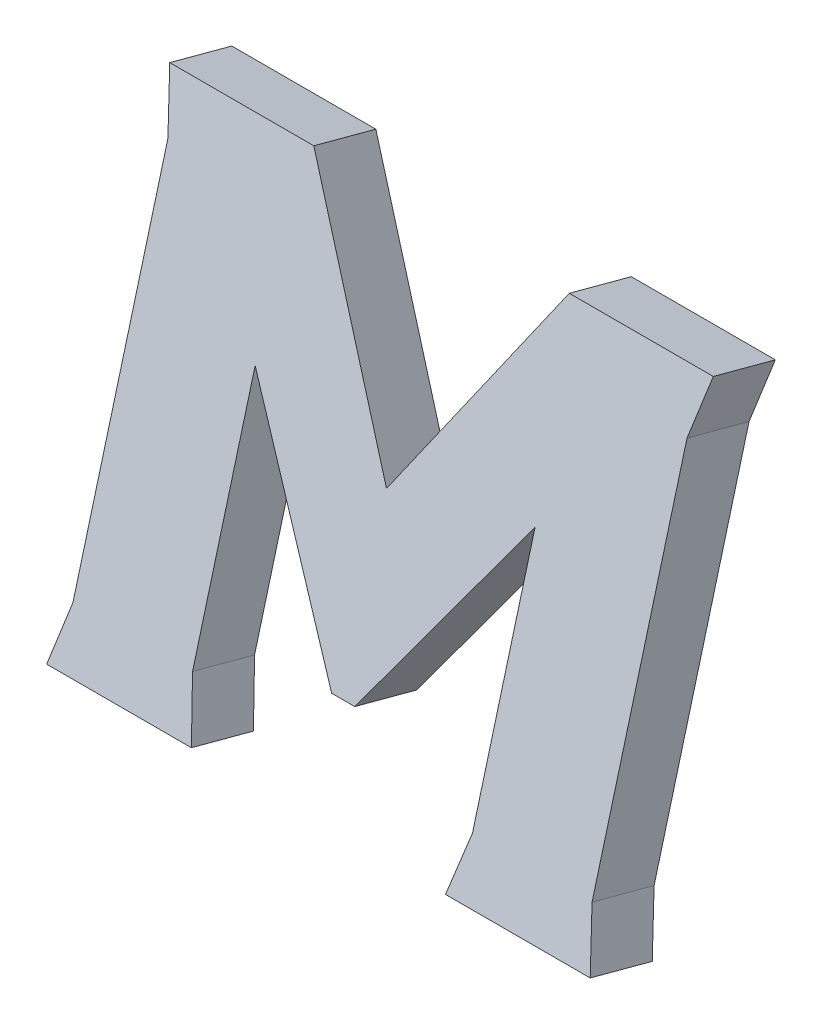
ISO-10303-21;
HEADER;
FILE_DESCRIPTION(('STEP AP214'),'2;1');
FILE_NAME('part.step','',(''),(''),'','','');
FILE_SCHEMA(('AUTOMOTIVE_DESIGN { 1 0 10303 214 1 1 1 1 }'));
ENDSEC;
DATA;
#1=APPLICATION_CONTEXT('core data for automotive mechanical design processes');
#2=APPLICATION_PROTOCOL_DEFINITION('international standard','automotive_design',2000,#1);
#3=PRODUCT_CONTEXT('',#1,'mechanical');
#4=PRODUCT('Part','Part','',(#3));
#5=PRODUCT_RELATED_PRODUCT_CATEGORY('part','',(#4));
#6=PRODUCT_DEFINITION_FORMATION('','',#4);
#7=PRODUCT_DEFINITION_CONTEXT('part definition',#1,'design');
#8=PRODUCT_DEFINITION('design','',#6,#7);
#9=PRODUCT_DEFINITION_SHAPE('','',#8);
#10=(LENGTH_UNIT() NAMED_UNIT(*) SI_UNIT(.MILLI.,.METRE.));
#11=(NAMED_UNIT(*) PLANE_ANGLE_UNIT() SI_UNIT($,.RADIAN.));
#12=(NAMED_UNIT(*) SI_UNIT($,.STERADIAN.) SOLID_ANGLE_UNIT());
#13=UNCERTAINTY_MEASURE_WITH_UNIT(LENGTH_MEASURE(1.E-05),#10,'distance_accuracy_value','');
#14=(GEOMETRIC_REPRESENTATION_CONTEXT(3) GLOBAL_UNCERTAINTY_ASSIGNED_CONTEXT((#13)) GLOBAL_UNIT_ASSIGNED_CONTEXT((#10,
#11,#12)) REPRESENTATION_CONTEXT('',''));
#15=CARTESIAN_POINT('',(0.,0.,0.));
#16=DIRECTION('',(0.,0.,1.));
#17=DIRECTION('',(1.,0.,0.));
#18=AXIS2_PLACEMENT_3D('',#15,#16,#17);
#19=CARTESIAN_POINT('',(5.71283602222444,197.836937315129,-21.9519621743323));
#20=DIRECTION('',(0.999999999999891,4.50875248794487E-07,-1.20811658801663E-07));
#21=DIRECTION('',(-4.50875248794491E-07,0.999999999999899,0.));
#22=AXIS2_PLACEMENT_3D('',#19,#20,#21);
#23=PLANE('',#22);
#24=DIRECTION('',(4.66780405413403E-07,-0.965925826288964,0.25881904510249));
#25=VECTOR('',#24,1.);
#26=CARTESIAN_POINT('',(5.71283602222444,190.072365962053,-50.9297369630043));
#27=LINE('',#26,#25);
#28=CARTESIAN_POINT('',(5.71283602222444,190.072365962053,-50.9297369630043));
#29=VERTEX_POINT('',#28);
#30=CARTESIAN_POINT('',(5.71291602222442,24.5254295570136,-6.57156904382809));
#31=VERTEX_POINT('',#30);
#32=EDGE_CURVE('E205',#29,#31,#27,.T.);
#33=ORIENTED_EDGE('',*,*,#32,.T.);
#34=DIRECTION('',(0.,-0.258819045102518,-0.965925826289069));
#35=VECTOR('',#34,1.);
#36=CARTESIAN_POINT('',(5.71291602222442,32.2900009100891,22.406205744844));
#37=LINE('',#36,#35);
#38=CARTESIAN_POINT('',(5.71291602222442,32.2900009100891,22.406205744844));
#39=VERTEX_POINT('',#38);
#40=EDGE_CURVE('E11',#39,#31,#37,.T.);
#41=ORIENTED_EDGE('',*,*,#40,.F.);
#42=DIRECTION('',(4.66780405413403E-07,-0.965925826288964,0.25881904510249));
#43=VECTOR('',#42,1.);
#44=CARTESIAN_POINT('',(5.71283602222444,197.836937315129,-21.9519621743323));
#45=LINE('',#44,#43);
#46=CARTESIAN_POINT('',(5.71283602222444,197.836937315129,-21.9519621743323));
#47=VERTEX_POINT('',#46);
#48=EDGE_CURVE('E241',#47,#39,#45,.T.);
#49=ORIENTED_EDGE('',*,*,#48,.F.);
#50=DIRECTION('',(0.,-0.258819045102518,-0.965925826289069));
#51=VECTOR('',#50,1.);
#52=CARTESIAN_POINT('',(5.71283602222444,197.836937315129,-21.9519621743323));
#53=LINE('',#52,#51);
#54=EDGE_CURVE('E201',#47,#29,#53,.T.);
#55=ORIENTED_EDGE('',*,*,#54,.T.);
#56=EDGE_LOOP('',(#33,#41,#49,#55));
#57=FACE_BOUND('',#56,.T.);
#58=ADVANCED_FACE('F43',(#57),#23,.F.);
#59=CARTESIAN_POINT('',(5.71291602222442,32.2900009100891,22.406205744844));
#60=DIRECTION('',(0.975609468087844,-0.212033734876684,0.0568142680283616));
#61=DIRECTION('',(0.212376773277867,0.977187856132116,0.));
#62=AXIS2_PLACEMENT_3D('',#59,#60,#61);
#63=PLANE('',#62);
#64=DIRECTION('',(-0.219513475161218,-0.94236638159819,0.252506310923471));
#65=VECTOR('',#64,1.);
#66=CARTESIAN_POINT('',(5.71291602222442,24.5254295570136,-6.57156904382809));
#67=LINE('',#66,#65);
#68=CARTESIAN_POINT('',(-3.97777558579935E-06,-6.72796169791307E-06,1.80275190366331E-06));
#69=VERTEX_POINT('',#68);
#70=EDGE_CURVE('E208',#31,#69,#67,.T.);
#71=ORIENTED_EDGE('',*,*,#70,.T.);
#72=DIRECTION('',(0.,-0.258819045102518,-0.965925826289069));
#73=VECTOR('',#72,1.);
#74=CARTESIAN_POINT('',(-3.97777558579935E-06,7.76456462511384,28.977776591424));
#75=LINE('',#74,#73);
#76=CARTESIAN_POINT('',(-3.97777558579935E-06,7.76456462511384,28.977776591424));
#77=VERTEX_POINT('',#76);
#78=EDGE_CURVE('E51',#77,#69,#75,.T.);
#79=ORIENTED_EDGE('',*,*,#78,.F.);
#80=DIRECTION('',(-0.219513475161218,-0.94236638159819,0.252506310923471));
#81=VECTOR('',#80,1.);
#82=CARTESIAN_POINT('',(5.71291602222442,32.2900009100891,22.406205744844));
#83=LINE('',#82,#81);
#84=EDGE_CURVE('E135',#39,#77,#83,.T.);
#85=ORIENTED_EDGE('',*,*,#84,.F.);
#86=ORIENTED_EDGE('',*,*,#40,.T.);
#87=EDGE_LOOP('',(#71,#79,#85,#86));
#88=FACE_BOUND('',#87,.T.);
#89=ADVANCED_FACE('F354',(#88),#63,.F.);
#90=CARTESIAN_POINT('',(-3.97777558579935E-06,7.76456462511384,28.977776591424));
#91=DIRECTION('',(5.91664161961705E-06,0.965925826272162,-0.258819045097988));
#92=DIRECTION('',(0.,0.258819045102518,0.965925826289069));
#93=AXIS2_PLACEMENT_3D('',#90,#91,#92);
#94=PLANE('',#93);
#95=DIRECTION('',(0.999999999982497,-5.7150369452849E-06,1.5313395342031E-06));
#96=VECTOR('',#95,1.);
#97=CARTESIAN_POINT('',(-3.97777558579935E-06,-6.72796169791307E-06,1.80275190366331E-06));
#98=LINE('',#97,#96);
#99=CARTESIAN_POINT('',(67.6059160222244,-0.000393098292224651,0.000105330369947647));
#100=VERTEX_POINT('',#99);
#101=EDGE_CURVE('E210',#69,#100,#98,.T.);
#102=ORIENTED_EDGE('',*,*,#101,.T.);
#103=DIRECTION('',(0.,-0.258819045102518,-0.965925826289069));
#104=VECTOR('',#103,1.);
#105=CARTESIAN_POINT('',(67.6059160222244,7.76417825478331,28.977880119042));
#106=LINE('',#105,#104);
#107=CARTESIAN_POINT('',(67.6059160222244,7.76417825478331,28.977880119042));
#108=VERTEX_POINT('',#107);
#109=EDGE_CURVE('E281',#108,#100,#106,.T.);
#110=ORIENTED_EDGE('',*,*,#109,.F.);
#111=DIRECTION('',(0.999999999982497,-5.7150369452849E-06,1.5313395342031E-06));
#112=VECTOR('',#111,1.);
#113=CARTESIAN_POINT('',(-3.97777558579935E-06,7.76456462511384,28.977776591424));
#114=LINE('',#113,#112);
#115=EDGE_CURVE('E289',#77,#108,#114,.T.);
#116=ORIENTED_EDGE('',*,*,#115,.F.);
#117=ORIENTED_EDGE('',*,*,#78,.T.);
#118=EDGE_LOOP('',(#102,#110,#116,#117));
#119=FACE_BOUND('',#118,.T.);
#120=ADVANCED_FACE('F287',(#119),#94,.F.);
#121=CARTESIAN_POINT('',(67.6059160222244,7.76417825478331,28.977880119042));
#122=DIRECTION('',(-0.972908180052972,-0.223314182251239,0.0598368547926354));
#123=DIRECTION('',(0.22371504155692,-0.974654595321433,0.));
#124=AXIS2_PLACEMENT_3D('',#121,#122,#123);
#125=PLANE('',#124);
#126=DIRECTION('',(-0.231191853632464,0.939757137721061,-0.251807166133739));
#127=VECTOR('',#126,1.);
#128=CARTESIAN_POINT('',(67.6059160222244,-0.000393098292224651,0.000105330369947647));
#129=LINE('',#128,#127);
#130=CARTESIAN_POINT('',(61.5723560222244,24.525043186683,-6.57146551621006));
#131=VERTEX_POINT('',#130);
#132=EDGE_CURVE('E212',#100,#131,#129,.T.);
#133=ORIENTED_EDGE('',*,*,#132,.T.);
#134=DIRECTION('',(0.,-0.258819045102518,-0.965925826289069));
#135=VECTOR('',#134,1.);
#136=CARTESIAN_POINT('',(61.5723560222244,32.2896145397586,22.406309272462));
#137=LINE('',#136,#135);
#138=CARTESIAN_POINT('',(61.5723560222244,32.2896145397586,22.406309272462));
#139=VERTEX_POINT('',#138);
#140=EDGE_CURVE('E278',#139,#131,#137,.T.);
#141=ORIENTED_EDGE('',*,*,#140,.F.);
#142=DIRECTION('',(-0.231191853632464,0.939757137721061,-0.251807166133739));
#143=VECTOR('',#142,1.);
#144=CARTESIAN_POINT('',(67.6059160222244,7.76417825478331,28.977880119042));
#145=LINE('',#144,#143);
#146=EDGE_CURVE('E307',#108,#139,#145,.T.);
#147=ORIENTED_EDGE('',*,*,#146,.F.);
#148=ORIENTED_EDGE('',*,*,#109,.T.);
#149=EDGE_LOOP('',(#133,#141,#147,#148));
#150=FACE_BOUND('',#149,.T.);
#151=ADVANCED_FACE('F298',(#150),#125,.F.);
#152=CARTESIAN_POINT('',(61.5723560222244,32.2896145397586,22.406309272462));
#153=DIRECTION('',(-0.999999999992418,-3.76147995789642E-06,1.00788551706419E-06));
#154=DIRECTION('',(3.76147995789833E-06,-0.999999999992926,0.));
#155=AXIS2_PLACEMENT_3D('',#152,#153,#154);
#156=PLANE('',#155);
#157=DIRECTION('',(-3.89417060350008E-06,0.965925826281745,-0.258819045100556));
#158=VECTOR('',#157,1.);
#159=CARTESIAN_POINT('',(61.5723560222244,24.525043186683,-6.57146551621006));
#160=LINE('',#159,#158);
#161=CARTESIAN_POINT('',(61.5719160222244,133.664422743589,-35.8152741309165));
#162=VERTEX_POINT('',#161);
#163=EDGE_CURVE('E214',#131,#162,#160,.T.);
#164=ORIENTED_EDGE('',*,*,#163,.T.);
#165=DIRECTION('',(0.,-0.258819045102518,-0.965925826289069));
#166=VECTOR('',#165,1.);
#167=CARTESIAN_POINT('',(61.5719160222244,141.428994096665,-6.83749934224441));
#168=LINE('',#167,#166);
#169=CARTESIAN_POINT('',(61.5719160222244,141.428994096665,-6.83749934224441));
#170=VERTEX_POINT('',#169);
#171=EDGE_CURVE('E275',#170,#162,#168,.T.);
#172=ORIENTED_EDGE('',*,*,#171,.F.);
#173=DIRECTION('',(-3.89417060350008E-06,0.965925826281745,-0.258819045100556));
#174=VECTOR('',#173,1.);
#175=CARTESIAN_POINT('',(61.5723560222244,32.2896145397586,22.406309272462));
#176=LINE('',#175,#174);
#177=EDGE_CURVE('E304',#139,#170,#176,.T.);
#178=ORIENTED_EDGE('',*,*,#177,.F.);
#179=ORIENTED_EDGE('',*,*,#140,.T.);
#180=EDGE_LOOP('',(#164,#172,#178,#179));
#181=FACE_BOUND('',#180,.T.);
#182=ADVANCED_FACE('F302',(#181),#156,.F.);
#183=CARTESIAN_POINT('',(61.5719160222244,141.428994096665,-6.83749934224441));
#184=DIRECTION('',(0.842009653147177,0.521080720867627,-0.139623158347906));
#185=DIRECTION('',(-0.526235347120746,0.850338967377544,0.));
#186=AXIS2_PLACEMENT_3D('',#183,#184,#185);
#187=PLANE('',#186);
#188=DIRECTION('',(0.539462458385169,-0.813318869959559,0.217928134394655));
#189=VECTOR('',#188,1.);
#190=CARTESIAN_POINT('',(61.5719160222244,133.664422743589,-35.8152741309165));
#191=LINE('',#190,#189);
#192=CARTESIAN_POINT('',(121.557916022224,43.2267194797962,-11.5825645760579));
#193=VERTEX_POINT('',#192);
#194=EDGE_CURVE('E216',#162,#193,#191,.T.);
#195=ORIENTED_EDGE('',*,*,#194,.T.);
#196=DIRECTION('',(0.,-0.258819045102518,-0.965925826289069));
#197=VECTOR('',#196,1.);
#198=CARTESIAN_POINT('',(121.557916022224,50.9912908328717,17.3952102126141));
#199=LINE('',#198,#197);
#200=CARTESIAN_POINT('',(121.557916022224,50.9912908328717,17.3952102126141));
#201=VERTEX_POINT('',#200);
#202=EDGE_CURVE('E272',#201,#193,#199,.T.);
#203=ORIENTED_EDGE('',*,*,#202,.F.);
#204=DIRECTION('',(0.539462458385169,-0.813318869959559,0.217928134394655));
#205=VECTOR('',#204,1.);
#206=CARTESIAN_POINT('',(61.5719160222244,141.428994096665,-6.83749934224441));
#207=LINE('',#206,#205);
#208=EDGE_CURVE('E306',#170,#201,#207,.T.);
#209=ORIENTED_EDGE('',*,*,#208,.F.);
#210=ORIENTED_EDGE('',*,*,#171,.T.);
#211=EDGE_LOOP('',(#195,#203,#209,#210));
#212=FACE_BOUND('',#211,.T.);
#213=ADVANCED_FACE('F367',(#212),#187,.F.);
#214=CARTESIAN_POINT('',(121.557916022224,50.9912908328717,17.3952102126141));
#215=DIRECTION('',(0.,0.965925826289069,-0.258819045102518));
#216=DIRECTION('',(0.,0.258819045102518,0.965925826289069));
#217=AXIS2_PLACEMENT_3D('',#214,#215,#216);
#218=PLANE('',#217);
#219=DIRECTION('',(1.,0.,0.));
#220=VECTOR('',#219,1.);
#221=CARTESIAN_POINT('',(121.557916022224,43.2267194797962,-11.5825645760579));
#222=LINE('',#221,#220);
#223=CARTESIAN_POINT('',(132.350916022224,43.2267194797962,-11.5825645760579));
#224=VERTEX_POINT('',#223);
#225=EDGE_CURVE('E218',#193,#224,#222,.T.);
#226=ORIENTED_EDGE('',*,*,#225,.T.);
#227=DIRECTION('',(0.,-0.258819045102518,-0.965925826289069));
#228=VECTOR('',#227,1.);
#229=CARTESIAN_POINT('',(132.350916022224,50.9912908328717,17.3952102126141));
#230=LINE('',#229,#228);
#231=CARTESIAN_POINT('',(132.350916022224,50.9912908328717,17.3952102126141));
#232=VERTEX_POINT('',#231);
#233=EDGE_CURVE('E269',#232,#224,#230,.T.);
#234=ORIENTED_EDGE('',*,*,#233,.F.);
#235=DIRECTION('',(1.,0.,0.));
#236=VECTOR('',#235,1.);
#237=CARTESIAN_POINT('',(121.557916022224,50.9912908328717,17.3952102126141));
#238=LINE('',#237,#236);
#239=EDGE_CURVE('E309',#201,#232,#238,.T.);
#240=ORIENTED_EDGE('',*,*,#239,.F.);
#241=ORIENTED_EDGE('',*,*,#202,.T.);
#242=EDGE_LOOP('',(#226,#234,#240,#241));
#243=FACE_BOUND('',#242,.T.);
#244=ADVANCED_FACE('F370',(#243),#218,.F.);
#245=CARTESIAN_POINT('',(132.350916022224,50.9912908328717,17.3952102126141));
#246=DIRECTION('',(-0.842028035456382,0.521053005797697,-0.1396157321173));
#247=DIRECTION('',(-0.526206801445373,-0.850356632309427,0.));
#248=AXIS2_PLACEMENT_3D('',#245,#246,#247);
#249=PLANE('',#248);
#250=DIRECTION('',(0.539433765633433,0.813336625906768,-0.21793289208637));
#251=VECTOR('',#250,1.);
#252=CARTESIAN_POINT('',(132.350916022224,43.2267194797962,-11.5825645760579));
#253=LINE('',#252,#251);
#254=CARTESIAN_POINT('',(192.332416022224,133.664422743589,-35.8152741309164));
#255=VERTEX_POINT('',#254);
#256=EDGE_CURVE('E220',#224,#255,#253,.T.);
#257=ORIENTED_EDGE('',*,*,#256,.T.);
#258=DIRECTION('',(0.,-0.258819045102518,-0.965925826289069));
#259=VECTOR('',#258,1.);
#260=CARTESIAN_POINT('',(192.332416022224,141.428994096664,-6.83749934224431));
#261=LINE('',#260,#259);
#262=CARTESIAN_POINT('',(192.332416022224,141.428994096664,-6.83749934224431));
#263=VERTEX_POINT('',#262);
#264=EDGE_CURVE('E266',#263,#255,#261,.T.);
#265=ORIENTED_EDGE('',*,*,#264,.F.);
#266=DIRECTION('',(0.539433765633433,0.813336625906768,-0.21793289208637));
#267=VECTOR('',#266,1.);
#268=CARTESIAN_POINT('',(132.350916022224,50.9912908328717,17.3952102126141));
#269=LINE('',#268,#267);
#270=EDGE_CURVE('E315',#232,#263,#269,.T.);
#271=ORIENTED_EDGE('',*,*,#270,.F.);
#272=ORIENTED_EDGE('',*,*,#233,.T.);
#273=EDGE_LOOP('',(#257,#265,#271,#272));
#274=FACE_BOUND('',#273,.T.);
#275=ADVANCED_FACE('F374',(#274),#249,.F.);
#276=CARTESIAN_POINT('',(192.332416022224,141.428994096664,-6.83749934224431));
#277=DIRECTION('',(1.,0.,0.));
#278=DIRECTION('',(0.,0.,-1.));
#279=AXIS2_PLACEMENT_3D('',#276,#277,#278);
#280=PLANE('',#279);
#281=DIRECTION('',(0.,-0.965925826289069,0.258819045102518));
#282=VECTOR('',#281,1.);
#283=CARTESIAN_POINT('',(192.332416022224,133.664422743589,-35.8152741309164));
#284=LINE('',#283,#282);
#285=CARTESIAN_POINT('',(192.332416022224,24.5254295570126,-6.57156904382785));
#286=VERTEX_POINT('',#285);
#287=EDGE_CURVE('E222',#255,#286,#284,.T.);
#288=ORIENTED_EDGE('',*,*,#287,.T.);
#289=DIRECTION('',(0.,-0.258819045102518,-0.965925826289069));
#290=VECTOR('',#289,1.);
#291=CARTESIAN_POINT('',(192.332416022224,32.2900009100882,22.4062057448442));
#292=LINE('',#291,#290);
#293=CARTESIAN_POINT('',(192.332416022224,32.2900009100882,22.4062057448442));
#294=VERTEX_POINT('',#293);
#295=EDGE_CURVE('E263',#294,#286,#292,.T.);
#296=ORIENTED_EDGE('',*,*,#295,.F.);
#297=DIRECTION('',(0.,-0.965925826289069,0.258819045102518));
#298=VECTOR('',#297,1.);
#299=CARTESIAN_POINT('',(192.332416022224,141.428994096664,-6.83749934224431));
#300=LINE('',#299,#298);
#301=EDGE_CURVE('E317',#263,#294,#300,.T.);
#302=ORIENTED_EDGE('',*,*,#301,.F.);
#303=ORIENTED_EDGE('',*,*,#264,.T.);
#304=EDGE_LOOP('',(#288,#296,#302,#303));
#305=FACE_BOUND('',#304,.T.);
#306=ADVANCED_FACE('F378',(#305),#280,.F.);
#307=CARTESIAN_POINT('',(192.332416022224,32.2900009100882,22.4062057448442));
#308=DIRECTION('',(0.972944109727372,-0.223168083503276,0.0597977077511034));
#309=DIRECTION('',(0.223568155151618,0.974688298894627,0.));
#310=AXIS2_PLACEMENT_3D('',#307,#308,#309);
#311=PLANE('',#310);
#312=DIRECTION('',(-0.231040601078709,-0.939791843121495,0.251816465417758));
#313=VECTOR('',#312,1.);
#314=CARTESIAN_POINT('',(192.332416022224,24.5254295570126,-6.57156904382785));
#315=LINE('',#314,#313);
#316=CARTESIAN_POINT('',(186.303026022224,-6.7279617247229E-06,1.80275191084698E-06));
#317=VERTEX_POINT('',#316);
#318=EDGE_CURVE('E224',#286,#317,#315,.T.);
#319=ORIENTED_EDGE('',*,*,#318,.T.);
#320=DIRECTION('',(0.,-0.258819045102518,-0.965925826289069));
#321=VECTOR('',#320,1.);
#322=CARTESIAN_POINT('',(186.303026022224,7.76456462511381,28.977776591424));
#323=LINE('',#322,#321);
#324=CARTESIAN_POINT('',(186.303026022224,7.76456462511381,28.977776591424));
#325=VERTEX_POINT('',#324);
#326=EDGE_CURVE('E260',#325,#317,#323,.T.);
#327=ORIENTED_EDGE('',*,*,#326,.F.);
#328=DIRECTION('',(-0.231040601078709,-0.939791843121495,0.251816465417758));
#329=VECTOR('',#328,1.);
#330=CARTESIAN_POINT('',(192.332416022224,32.2900009100882,22.4062057448442));
#331=LINE('',#330,#329);
#332=EDGE_CURVE('E319',#294,#325,#331,.T.);
#333=ORIENTED_EDGE('',*,*,#332,.F.);
#334=ORIENTED_EDGE('',*,*,#295,.T.);
#335=EDGE_LOOP('',(#319,#327,#333,#334));
#336=FACE_BOUND('',#335,.T.);
#337=ADVANCED_FACE('F382',(#336),#311,.F.);
#338=CARTESIAN_POINT('',(186.303026022224,7.76456462511381,28.977776591424));
#339=DIRECTION('',(5.91691555932085E-06,0.965925826272161,-0.258819045097987));
#340=DIRECTION('',(0.,0.258819045102518,0.965925826289069));
#341=AXIS2_PLACEMENT_3D('',#338,#339,#340);
#342=PLANE('',#341);
#343=DIRECTION('',(0.999999999982495,-5.71530155071964E-06,1.53141043501565E-06));
#344=VECTOR('',#343,1.);
#345=CARTESIAN_POINT('',(186.303026022224,-6.7279617247229E-06,1.80275191084698E-06));
#346=LINE('',#345,#344);
#347=CARTESIAN_POINT('',(253.905816022224,-0.000393098292251461,0.000105330369954831));
#348=VERTEX_POINT('',#347);
#349=EDGE_CURVE('E226',#317,#348,#346,.T.);
#350=ORIENTED_EDGE('',*,*,#349,.T.);
#351=DIRECTION('',(0.,-0.258819045102518,-0.965925826289069));
#352=VECTOR('',#351,1.);
#353=CARTESIAN_POINT('',(253.905816022224,7.76417825478329,28.977880119042));
#354=LINE('',#353,#352);
#355=CARTESIAN_POINT('',(253.905816022224,7.76417825478329,28.977880119042));
#356=VERTEX_POINT('',#355);
#357=EDGE_CURVE('E257',#356,#348,#354,.T.);
#358=ORIENTED_EDGE('',*,*,#357,.F.);
#359=DIRECTION('',(0.999999999982495,-5.71530155071964E-06,1.53141043501565E-06));
#360=VECTOR('',#359,1.);
#361=CARTESIAN_POINT('',(186.303026022224,7.76456462511381,28.977776591424));
#362=LINE('',#361,#360);
#363=EDGE_CURVE('E321',#325,#356,#362,.T.);
#364=ORIENTED_EDGE('',*,*,#363,.F.);
#365=ORIENTED_EDGE('',*,*,#326,.T.);
#366=EDGE_LOOP('',(#350,#358,#364,#365));
#367=FACE_BOUND('',#366,.T.);
#368=ADVANCED_FACE('F386',(#367),#342,.F.);
#369=CARTESIAN_POINT('',(253.905816022224,7.76417825478329,28.977880119042));
#370=DIRECTION('',(-0.975612841821234,-0.212019250995848,0.0568103870841883));
#371=DIRECTION('',(0.212362218989904,-0.977191019169581,0.));
#372=AXIS2_PLACEMENT_3D('',#369,#370,#371);
#373=PLANE('',#372);
#374=DIRECTION('',(-0.219498480344388,0.942369640374402,-0.252507184109926));
#375=VECTOR('',#374,1.);
#376=CARTESIAN_POINT('',(253.905816022224,-0.000393098292251461,0.000105330369954831));
#377=LINE('',#376,#375);
#378=CARTESIAN_POINT('',(248.193306022224,24.5250431866831,-6.57146551621008));
#379=VERTEX_POINT('',#378);
#380=EDGE_CURVE('E228',#348,#379,#377,.T.);
#381=ORIENTED_EDGE('',*,*,#380,.T.);
#382=DIRECTION('',(0.,-0.258819045102518,-0.965925826289069));
#383=VECTOR('',#382,1.);
#384=CARTESIAN_POINT('',(248.193306022224,32.2896145397587,22.406309272462));
#385=LINE('',#384,#383);
#386=CARTESIAN_POINT('',(248.193306022224,32.2896145397587,22.406309272462));
#387=VERTEX_POINT('',#386);
#388=EDGE_CURVE('E254',#387,#379,#385,.T.);
#389=ORIENTED_EDGE('',*,*,#388,.F.);
#390=DIRECTION('',(-0.219498480344388,0.942369640374402,-0.252507184109926));
#391=VECTOR('',#390,1.);
#392=CARTESIAN_POINT('',(253.905816022224,7.76417825478329,28.977880119042));
#393=LINE('',#392,#391);
#394=EDGE_CURVE('E323',#356,#387,#393,.T.);
#395=ORIENTED_EDGE('',*,*,#394,.F.);
#396=ORIENTED_EDGE('',*,*,#357,.T.);
#397=EDGE_LOOP('',(#381,#389,#395,#396));
#398=FACE_BOUND('',#397,.T.);
#399=ADVANCED_FACE('F390',(#398),#373,.F.);
#400=CARTESIAN_POINT('',(248.193306022224,32.2896145397587,22.406309272462));
#401=DIRECTION('',(-0.999999999999985,-1.69077626321532E-07,4.53042134310252E-08));
#402=DIRECTION('',(1.69077626321533E-07,-0.999999999999986,0.));
#403=AXIS2_PLACEMENT_3D('',#400,#401,#402);
#404=PLANE('',#403);
#405=DIRECTION('',(-1.75042039170959E-07,0.965925826289054,-0.258819045102514));
#406=VECTOR('',#405,1.);
#407=CARTESIAN_POINT('',(248.193306022224,24.5250431866831,-6.57146551621008));
#408=LINE('',#407,#406);
#409=CARTESIAN_POINT('',(248.193276022224,190.072559147218,-50.9297887268133));
#410=VERTEX_POINT('',#409);
#411=EDGE_CURVE('E230',#379,#410,#408,.T.);
#412=ORIENTED_EDGE('',*,*,#411,.T.);
#413=DIRECTION('',(0.,-0.258819045102518,-0.965925826289069));
#414=VECTOR('',#413,1.);
#415=CARTESIAN_POINT('',(248.193276022224,197.837130500294,-21.9520139381413));
#416=LINE('',#415,#414);
#417=CARTESIAN_POINT('',(248.193276022224,197.837130500294,-21.9520139381413));
#418=VERTEX_POINT('',#417);
#419=EDGE_CURVE('E251',#418,#410,#416,.T.);
#420=ORIENTED_EDGE('',*,*,#419,.F.);
#421=DIRECTION('',(-1.75042039170959E-07,0.965925826289054,-0.258819045102514));
#422=VECTOR('',#421,1.);
#423=CARTESIAN_POINT('',(248.193306022224,32.2896145397587,22.406309272462));
#424=LINE('',#423,#422);
#425=EDGE_CURVE('E325',#387,#418,#424,.T.);
#426=ORIENTED_EDGE('',*,*,#425,.F.);
#427=ORIENTED_EDGE('',*,*,#388,.T.);
#428=EDGE_LOOP('',(#412,#420,#426,#427));
#429=FACE_BOUND('',#428,.T.);
#430=ADVANCED_FACE('F394',(#429),#404,.F.);
#431=CARTESIAN_POINT('',(248.193276022224,197.837130500294,-21.9520139381413));
#432=DIRECTION('',(-0.9756121013003,0.212022430238584,-0.056811238959712));
#433=DIRECTION('',(-0.212365413686328,-0.977190324895736,0.));
#434=AXIS2_PLACEMENT_3D('',#431,#432,#433);
#435=PLANE('',#434);
#436=DIRECTION('',(0.219501771738665,0.942368925086107,-0.252506992449005));
#437=VECTOR('',#436,1.);
#438=CARTESIAN_POINT('',(248.193276022224,190.072559147218,-50.9297887268133));
#439=LINE('',#438,#437);
#440=CARTESIAN_POINT('',(253.905786022225,214.597609061863,-57.5012560457754));
#441=VERTEX_POINT('',#440);
#442=EDGE_CURVE('E232',#410,#441,#439,.T.);
#443=ORIENTED_EDGE('',*,*,#442,.T.);
#444=DIRECTION('',(0.,-0.258819045102518,-0.965925826289069));
#445=VECTOR('',#444,1.);
#446=CARTESIAN_POINT('',(253.905786022225,222.362180414939,-28.5234812571033));
#447=LINE('',#446,#445);
#448=CARTESIAN_POINT('',(253.905786022225,222.362180414939,-28.5234812571033));
#449=VERTEX_POINT('',#448);
#450=EDGE_CURVE('E248',#449,#441,#447,.T.);
#451=ORIENTED_EDGE('',*,*,#450,.F.);
#452=DIRECTION('',(0.219501771738665,0.942368925086107,-0.252506992449005));
#453=VECTOR('',#452,1.);
#454=CARTESIAN_POINT('',(248.193276022224,197.837130500294,-21.9520139381413));
#455=LINE('',#454,#453);
#456=EDGE_CURVE('E327',#418,#449,#455,.T.);
#457=ORIENTED_EDGE('',*,*,#456,.F.);
#458=ORIENTED_EDGE('',*,*,#419,.T.);
#459=EDGE_LOOP('',(#443,#451,#457,#458));
#460=FACE_BOUND('',#459,.T.);
#461=ADVANCED_FACE('F398',(#460),#435,.F.);
#462=CARTESIAN_POINT('',(253.905786022225,222.362180414939,-28.5234812571033));
#463=DIRECTION('',(2.9723701838218E-06,-0.965925826284802,0.258819045101375));
#464=DIRECTION('',(0.,-0.258819045102518,-0.965925826289069));
#465=AXIS2_PLACEMENT_3D('',#462,#463,#464);
#466=PLANE('',#465);
#467=DIRECTION('',(-0.999999999995583,-2.87108912585232E-06,7.69306012640889E-07));
#468=VECTOR('',#467,1.);
#469=CARTESIAN_POINT('',(253.905786022225,214.597609061863,-57.5012560457754));
#470=LINE('',#469,#468);
#471=CARTESIAN_POINT('',(186.619416022225,214.597415876698,-57.5012042819664));
#472=VERTEX_POINT('',#471);
#473=EDGE_CURVE('E234',#441,#472,#470,.T.);
#474=ORIENTED_EDGE('',*,*,#473,.T.);
#475=DIRECTION('',(0.,-0.258819045102518,-0.965925826289069));
#476=VECTOR('',#475,1.);
#477=CARTESIAN_POINT('',(186.619416022225,222.361987229774,-28.5234294932943));
#478=LINE('',#477,#476);
#479=CARTESIAN_POINT('',(186.619416022225,222.361987229774,-28.5234294932943));
#480=VERTEX_POINT('',#479);
#481=EDGE_CURVE('E245',#480,#472,#478,.T.);
#482=ORIENTED_EDGE('',*,*,#481,.F.);
#483=DIRECTION('',(-0.999999999995583,-2.87108912585232E-06,7.69306012640889E-07));
#484=VECTOR('',#483,1.);
#485=CARTESIAN_POINT('',(253.905786022225,222.362180414939,-28.5234812571033));
#486=LINE('',#485,#484);
#487=EDGE_CURVE('E329',#449,#480,#486,.T.);
#488=ORIENTED_EDGE('',*,*,#487,.F.);
#489=ORIENTED_EDGE('',*,*,#450,.T.);
#490=EDGE_LOOP('',(#474,#482,#488,#489));
#491=FACE_BOUND('',#490,.T.);
#492=ADVANCED_FACE('F335',(#491),#466,.F.);
#493=CARTESIAN_POINT('',(186.619416022225,222.361987229774,-28.5234294932943));
#494=DIRECTION('',(0.857258161753015,-0.497342483336684,0.133262516771752));
#495=DIRECTION('',(0.50181831402938,0.864973051432651,0.));
#496=AXIS2_PLACEMENT_3D('',#493,#494,#495);
#497=PLANE('',#496);
#498=DIRECTION('',(-0.514886826504467,-0.82804779823433,0.221874738831255));
#499=VECTOR('',#498,1.);
#500=CARTESIAN_POINT('',(186.619416022225,214.597415876698,-57.5012042819664));
#501=LINE('',#500,#499);
#502=CARTESIAN_POINT('',(126.954316022224,118.643213626385,-31.7903532786227));
#503=VERTEX_POINT('',#502);
#504=EDGE_CURVE('E236',#472,#503,#501,.T.);
#505=ORIENTED_EDGE('',*,*,#504,.T.);
#506=DIRECTION('',(0.,-0.258819045102518,-0.965925826289069));
#507=VECTOR('',#506,1.);
#508=CARTESIAN_POINT('',(126.954316022224,126.407784979461,-2.81257848995065));
#509=LINE('',#508,#507);
#510=CARTESIAN_POINT('',(126.954316022224,126.407784979461,-2.81257848995065));
#511=VERTEX_POINT('',#510);
#512=EDGE_CURVE('E196',#511,#503,#509,.T.);
#513=ORIENTED_EDGE('',*,*,#512,.F.);
#514=DIRECTION('',(-0.514886826504467,-0.82804779823433,0.221874738831255));
#515=VECTOR('',#514,1.);
#516=CARTESIAN_POINT('',(186.619416022225,222.361987229774,-28.5234294932943));
#517=LINE('',#516,#515);
#518=EDGE_CURVE('E187',#480,#511,#517,.T.);
#519=ORIENTED_EDGE('',*,*,#518,.F.);
#520=ORIENTED_EDGE('',*,*,#481,.T.);
#521=EDGE_LOOP('',(#505,#513,#519,#520));
#522=FACE_BOUND('',#521,.T.);
#523=ADVANCED_FACE('F339',(#522),#497,.F.);
#524=CARTESIAN_POINT('',(126.954316022224,126.407784979461,-2.81257848995065));
#525=DIRECTION('',(-0.857242163696187,-0.497368210717573,0.133269410402685));
#526=DIRECTION('',(0.501844742317378,-0.864957718393451,0.));
#527=AXIS2_PLACEMENT_3D('',#524,#525,#526);
#528=PLANE('',#527);
#529=DIRECTION('',(-0.514913461449086,0.828032345298069,-0.221870598229464));
#530=VECTOR('',#529,1.);
#531=CARTESIAN_POINT('',(126.954316022224,118.643213626385,-31.7903532786227));
#532=LINE('',#531,#530);
#533=CARTESIAN_POINT('',(67.2850160222242,214.597415876698,-57.5012042819664));
#534=VERTEX_POINT('',#533);
#535=EDGE_CURVE('E195',#503,#534,#532,.T.);
#536=ORIENTED_EDGE('',*,*,#535,.T.);
#537=DIRECTION('',(0.,-0.258819045102518,-0.965925826289069));
#538=VECTOR('',#537,1.);
#539=CARTESIAN_POINT('',(67.2850160222242,222.361987229774,-28.5234294932943));
#540=LINE('',#539,#538);
#541=CARTESIAN_POINT('',(67.2850160222242,222.361987229774,-28.5234294932943));
#542=VERTEX_POINT('',#541);
#543=EDGE_CURVE('E192',#542,#534,#540,.T.);
#544=ORIENTED_EDGE('',*,*,#543,.F.);
#545=DIRECTION('',(-0.514913461449086,0.828032345298069,-0.221870598229464));
#546=VECTOR('',#545,1.);
#547=CARTESIAN_POINT('',(126.954316022224,126.407784979461,-2.81257848995065));
#548=LINE('',#547,#546);
#549=EDGE_CURVE('E181',#511,#542,#548,.T.);
#550=ORIENTED_EDGE('',*,*,#549,.F.);
#551=ORIENTED_EDGE('',*,*,#512,.T.);
#552=EDGE_LOOP('',(#536,#544,#550,#551));
#553=FACE_BOUND('',#552,.T.);
#554=ADVANCED_FACE('F193',(#553),#528,.F.);
#555=CARTESIAN_POINT('',(67.2850160222242,222.361987229774,-28.5234294932943));
#556=DIRECTION('',(0.,-0.965925826289069,0.258819045102518));
#557=DIRECTION('',(0.,-0.258819045102518,-0.965925826289069));
#558=AXIS2_PLACEMENT_3D('',#555,#556,#557);
#559=PLANE('',#558);
#560=DIRECTION('',(-1.,0.,0.));
#561=VECTOR('',#560,1.);
#562=CARTESIAN_POINT('',(67.2850160222242,214.597415876698,-57.5012042819664));
#563=LINE('',#562,#561);
#564=CARTESIAN_POINT('',(-8.39777756501269E-05,214.597415876698,-57.5012042819664));
#565=VERTEX_POINT('',#564);
#566=EDGE_CURVE('E121',#534,#565,#563,.T.);
#567=ORIENTED_EDGE('',*,*,#566,.T.);
#568=DIRECTION('',(0.,-0.258819045102518,-0.965925826289069));
#569=VECTOR('',#568,1.);
#570=CARTESIAN_POINT('',(-8.39777756501269E-05,222.361987229774,-28.5234294932943));
#571=LINE('',#570,#569);
#572=CARTESIAN_POINT('',(-8.39777756501269E-05,222.361987229774,-28.5234294932943));
#573=VERTEX_POINT('',#572);
#574=EDGE_CURVE('E197',#573,#565,#571,.T.);
#575=ORIENTED_EDGE('',*,*,#574,.F.);
#576=DIRECTION('',(-1.,0.,0.));
#577=VECTOR('',#576,1.);
#578=CARTESIAN_POINT('',(67.2850160222242,222.361987229774,-28.5234294932943));
#579=LINE('',#578,#577);
#580=EDGE_CURVE('E185',#542,#573,#579,.T.);
#581=ORIENTED_EDGE('',*,*,#580,.F.);
#582=ORIENTED_EDGE('',*,*,#543,.T.);
#583=EDGE_LOOP('',(#567,#575,#581,#582));
#584=FACE_BOUND('',#583,.T.);
#585=ADVANCED_FACE('F199',(#584),#559,.F.);
#586=CARTESIAN_POINT('',(-8.39777756501269E-05,222.361987229774,-28.5234294932943));
#587=DIRECTION('',(0.975608727468292,0.212036914314615,-0.0568151199561876));
#588=DIRECTION('',(-0.212379968172554,0.977187161765352,0.));
#589=AXIS2_PLACEMENT_3D('',#586,#587,#588);
#590=PLANE('',#589);
#591=DIRECTION('',(0.219516766757575,-0.942365666214638,0.252506119237026));
#592=VECTOR('',#591,1.);
#593=CARTESIAN_POINT('',(-8.39777756501269E-05,214.597415876698,-57.5012042819664));
#594=LINE('',#593,#592);
#595=EDGE_CURVE('E127',#565,#29,#594,.T.);
#596=ORIENTED_EDGE('',*,*,#595,.T.);
#597=ORIENTED_EDGE('',*,*,#54,.F.);
#598=DIRECTION('',(0.219516766757575,-0.942365666214638,0.252506119237026));
#599=VECTOR('',#598,1.);
#600=CARTESIAN_POINT('',(-8.39777756501269E-05,222.361987229774,-28.5234294932943));
#601=LINE('',#600,#599);
#602=EDGE_CURVE('E59',#573,#47,#601,.T.);
#603=ORIENTED_EDGE('',*,*,#602,.F.);
#604=ORIENTED_EDGE('',*,*,#574,.T.);
#605=EDGE_LOOP('',(#596,#597,#603,#604));
#606=FACE_BOUND('',#605,.T.);
#607=ADVANCED_FACE('F343',(#606),#590,.F.);
#608=CARTESIAN_POINT('',(0.,7.76457135307554,28.9777747886721));
#609=DIRECTION('',(0.,0.258819045102518,0.965925826289069));
#610=DIRECTION('',(0.,-0.965925826289069,0.258819045102518));
#611=AXIS2_PLACEMENT_3D('',#608,#609,#610);
#612=PLANE('',#611);
#613=ORIENTED_EDGE('',*,*,#48,.T.);
#614=ORIENTED_EDGE('',*,*,#84,.T.);
#615=ORIENTED_EDGE('',*,*,#115,.T.);
#616=ORIENTED_EDGE('',*,*,#146,.T.);
#617=ORIENTED_EDGE('',*,*,#177,.T.);
#618=ORIENTED_EDGE('',*,*,#208,.T.);
#619=ORIENTED_EDGE('',*,*,#239,.T.);
#620=ORIENTED_EDGE('',*,*,#270,.T.);
#621=ORIENTED_EDGE('',*,*,#301,.T.);
#622=ORIENTED_EDGE('',*,*,#332,.T.);
#623=ORIENTED_EDGE('',*,*,#363,.T.);
#624=ORIENTED_EDGE('',*,*,#394,.T.);
#625=ORIENTED_EDGE('',*,*,#425,.T.);
#626=ORIENTED_EDGE('',*,*,#456,.T.);
#627=ORIENTED_EDGE('',*,*,#487,.T.);
#628=ORIENTED_EDGE('',*,*,#518,.T.);
#629=ORIENTED_EDGE('',*,*,#549,.T.);
#630=ORIENTED_EDGE('',*,*,#580,.T.);
#631=ORIENTED_EDGE('',*,*,#602,.T.);
#632=EDGE_LOOP('',(#613,#614,#615,#616,#617,#618,#619,#620,#621,#622,#623,#624,#625,#626,#627,
#628,#629,#630,#631));
#633=FACE_BOUND('',#632,.T.);
#634=ADVANCED_FACE('F183',(#633),#612,.T.);
#635=CARTESIAN_POINT('',(0.,0.,0.));
#636=DIRECTION('',(0.,0.258819045102518,0.965925826289069));
#637=DIRECTION('',(0.,-0.965925826289069,0.258819045102518));
#638=AXIS2_PLACEMENT_3D('',#635,#636,#637);
#639=PLANE('',#638);
#640=ORIENTED_EDGE('',*,*,#32,.F.);
#641=ORIENTED_EDGE('',*,*,#595,.F.);
#642=ORIENTED_EDGE('',*,*,#566,.F.);
#643=ORIENTED_EDGE('',*,*,#535,.F.);
#644=ORIENTED_EDGE('',*,*,#504,.F.);
#645=ORIENTED_EDGE('',*,*,#473,.F.);
#646=ORIENTED_EDGE('',*,*,#442,.F.);
#647=ORIENTED_EDGE('',*,*,#411,.F.);
#648=ORIENTED_EDGE('',*,*,#380,.F.);
#649=ORIENTED_EDGE('',*,*,#349,.F.);
#650=ORIENTED_EDGE('',*,*,#318,.F.);
#651=ORIENTED_EDGE('',*,*,#287,.F.);
#652=ORIENTED_EDGE('',*,*,#256,.F.);
#653=ORIENTED_EDGE('',*,*,#225,.F.);
#654=ORIENTED_EDGE('',*,*,#194,.F.);
#655=ORIENTED_EDGE('',*,*,#163,.F.);
#656=ORIENTED_EDGE('',*,*,#132,.F.);
#657=ORIENTED_EDGE('',*,*,#101,.F.);
#658=ORIENTED_EDGE('',*,*,#70,.F.);
#659=EDGE_LOOP('',(#640,#641,#642,#643,#644,#645,#646,#647,#648,#649,#650,#651,#652,#653,#654,
#655,#656,#657,#658));
#660=FACE_BOUND('',#659,.T.);
#661=ADVANCED_FACE('F293',(#660),#639,.F.);
#662=CLOSED_SHELL('',(#58,#89,#120,#151,#182,#213,#244,#275,#306,#337,#368,#399,#430,#461,#492,
#523,#554,#585,#607,#634,#661));
#663=MANIFOLD_SOLID_BREP('B2',#662);
#664=ADVANCED_BREP_SHAPE_REPRESENTATION('',(#18,#663),#14);
#665=SHAPE_DEFINITION_REPRESENTATION(#9,#664);
ENDSEC;
END-ISO-10303-21;
